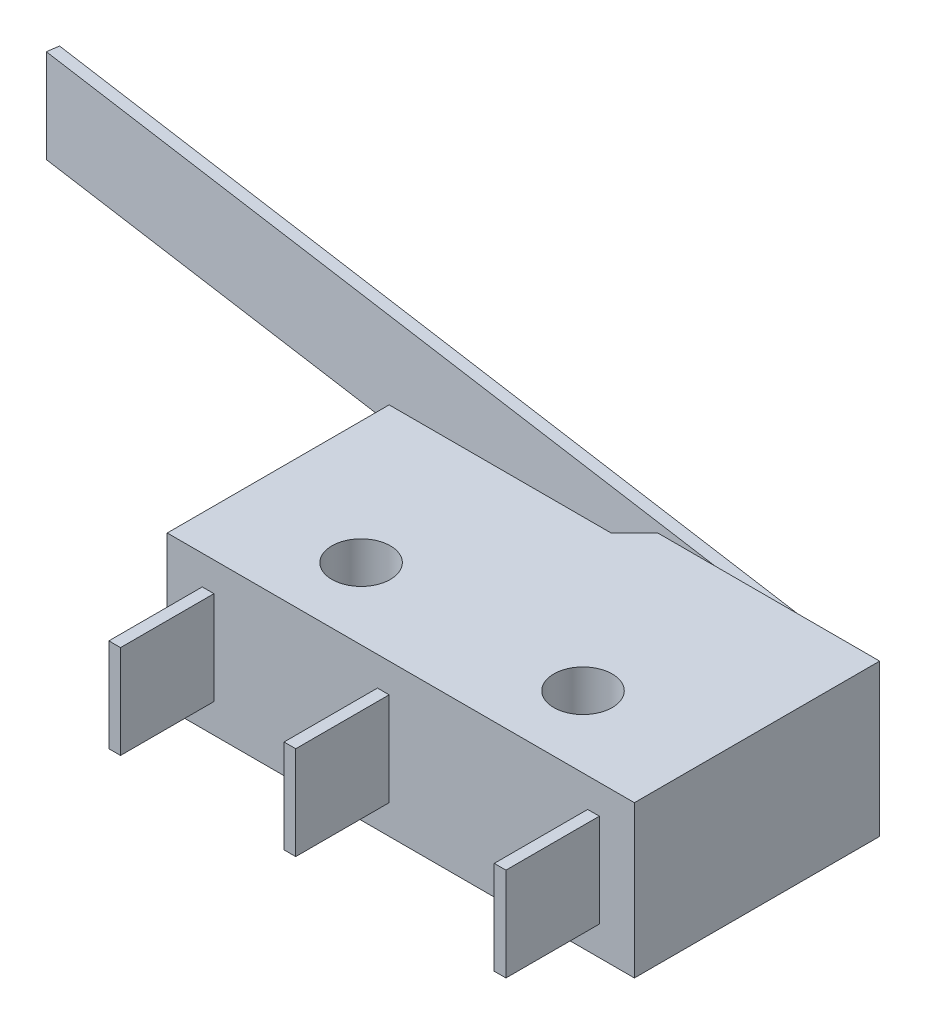
ISO-10303-21;
HEADER;
FILE_DESCRIPTION(('STEP AP214'),'2;1');
FILE_NAME('part.step','',(''),(''),'','','');
FILE_SCHEMA(('AUTOMOTIVE_DESIGN { 1 0 10303 214 1 1 1 1 }'));
ENDSEC;
DATA;
#1=APPLICATION_CONTEXT('core data for automotive mechanical design processes');
#2=APPLICATION_PROTOCOL_DEFINITION('international standard','automotive_design',2000,#1);
#3=PRODUCT_CONTEXT('',#1,'mechanical');
#4=PRODUCT('Part','Part','',(#3));
#5=PRODUCT_RELATED_PRODUCT_CATEGORY('part','',(#4));
#6=PRODUCT_DEFINITION_FORMATION('','',#4);
#7=PRODUCT_DEFINITION_CONTEXT('part definition',#1,'design');
#8=PRODUCT_DEFINITION('design','',#6,#7);
#9=PRODUCT_DEFINITION_SHAPE('','',#8);
#10=(LENGTH_UNIT() NAMED_UNIT(*) SI_UNIT(.MILLI.,.METRE.));
#11=(NAMED_UNIT(*) PLANE_ANGLE_UNIT() SI_UNIT($,.RADIAN.));
#12=(NAMED_UNIT(*) SI_UNIT($,.STERADIAN.) SOLID_ANGLE_UNIT());
#13=UNCERTAINTY_MEASURE_WITH_UNIT(LENGTH_MEASURE(1.E-05),#10,'distance_accuracy_value','');
#14=(GEOMETRIC_REPRESENTATION_CONTEXT(3) GLOBAL_UNCERTAINTY_ASSIGNED_CONTEXT((#13)) GLOBAL_UNIT_ASSIGNED_CONTEXT((#10,
#11,#12)) REPRESENTATION_CONTEXT('',''));
#15=CARTESIAN_POINT('',(0.,0.,0.));
#16=DIRECTION('',(0.,0.,1.));
#17=DIRECTION('',(1.,0.,0.));
#18=AXIS2_PLACEMENT_3D('',#15,#16,#17);
#19=CARTESIAN_POINT('',(0.,3.25,0.));
#20=DIRECTION('',(0.,0.,-1.));
#21=DIRECTION('',(-1.,0.,0.));
#22=AXIS2_PLACEMENT_3D('',#19,#20,#21);
#23=PLANE('',#22);
#24=DIRECTION('',(-1.,0.,0.));
#25=VECTOR('',#24,1.);
#26=CARTESIAN_POINT('',(9.5,2.,0.));
#27=LINE('',#26,#25);
#28=CARTESIAN_POINT('',(9.5,2.,0.));
#29=VERTEX_POINT('',#28);
#30=CARTESIAN_POINT('',(9.,2.,0.));
#31=VERTEX_POINT('',#30);
#32=EDGE_CURVE('E239',#29,#31,#27,.T.);
#33=ORIENTED_EDGE('',*,*,#32,.F.);
#34=DIRECTION('',(0.,-1.,0.));
#35=VECTOR('',#34,1.);
#36=CARTESIAN_POINT('',(9.5,2.,0.));
#37=LINE('',#36,#35);
#38=CARTESIAN_POINT('',(9.5,-2.,0.));
#39=VERTEX_POINT('',#38);
#40=EDGE_CURVE('E261',#29,#39,#37,.T.);
#41=ORIENTED_EDGE('',*,*,#40,.T.);
#42=DIRECTION('',(-1.,0.,0.));
#43=VECTOR('',#42,1.);
#44=CARTESIAN_POINT('',(9.5,-2.,0.));
#45=LINE('',#44,#43);
#46=CARTESIAN_POINT('',(9.,-2.,0.));
#47=VERTEX_POINT('',#46);
#48=EDGE_CURVE('E249',#39,#47,#45,.T.);
#49=ORIENTED_EDGE('',*,*,#48,.T.);
#50=DIRECTION('',(0.,-1.,0.));
#51=VECTOR('',#50,1.);
#52=CARTESIAN_POINT('',(9.,2.,0.));
#53=LINE('',#52,#51);
#54=EDGE_CURVE('E259',#31,#47,#53,.T.);
#55=ORIENTED_EDGE('',*,*,#54,.F.);
#56=EDGE_LOOP('',(#33,#41,#49,#55));
#57=FACE_BOUND('',#56,.T.);
#58=DIRECTION('',(1.,0.,0.));
#59=VECTOR('',#58,1.);
#60=CARTESIAN_POINT('',(0.,-3.25,0.));
#61=LINE('',#60,#59);
#62=CARTESIAN_POINT('',(0.,-3.25,0.));
#63=VERTEX_POINT('',#62);
#64=CARTESIAN_POINT('',(20.,-3.25,0.));
#65=VERTEX_POINT('',#64);
#66=EDGE_CURVE('E356',#63,#65,#61,.T.);
#67=ORIENTED_EDGE('',*,*,#66,.T.);
#68=DIRECTION('',(0.,-1.,0.));
#69=VECTOR('',#68,1.);
#70=CARTESIAN_POINT('',(20.,3.25,0.));
#71=LINE('',#70,#69);
#72=CARTESIAN_POINT('',(20.,3.25,0.));
#73=VERTEX_POINT('',#72);
#74=EDGE_CURVE('E41',#73,#65,#71,.T.);
#75=ORIENTED_EDGE('',*,*,#74,.F.);
#76=DIRECTION('',(1.,0.,0.));
#77=VECTOR('',#76,1.);
#78=CARTESIAN_POINT('',(0.,3.25,0.));
#79=LINE('',#78,#77);
#80=CARTESIAN_POINT('',(0.,3.25,0.));
#81=VERTEX_POINT('',#80);
#82=EDGE_CURVE('E342',#81,#73,#79,.T.);
#83=ORIENTED_EDGE('',*,*,#82,.F.);
#84=DIRECTION('',(0.,-1.,0.));
#85=VECTOR('',#84,1.);
#86=CARTESIAN_POINT('',(0.,3.25,0.));
#87=LINE('',#86,#85);
#88=EDGE_CURVE('E11',#81,#63,#87,.T.);
#89=ORIENTED_EDGE('',*,*,#88,.T.);
#90=EDGE_LOOP('',(#67,#75,#83,#89));
#91=FACE_BOUND('',#90,.T.);
#92=DIRECTION('',(-1.,0.,0.));
#93=VECTOR('',#92,1.);
#94=CARTESIAN_POINT('',(18.5,2.,0.));
#95=LINE('',#94,#93);
#96=CARTESIAN_POINT('',(18.5,2.,0.));
#97=VERTEX_POINT('',#96);
#98=CARTESIAN_POINT('',(18.,2.,0.));
#99=VERTEX_POINT('',#98);
#100=EDGE_CURVE('E267',#97,#99,#95,.T.);
#101=ORIENTED_EDGE('',*,*,#100,.F.);
#102=DIRECTION('',(0.,-1.,0.));
#103=VECTOR('',#102,1.);
#104=CARTESIAN_POINT('',(18.5,2.,0.));
#105=LINE('',#104,#103);
#106=CARTESIAN_POINT('',(18.5,-2.,0.));
#107=VERTEX_POINT('',#106);
#108=EDGE_CURVE('E291',#97,#107,#105,.T.);
#109=ORIENTED_EDGE('',*,*,#108,.T.);
#110=DIRECTION('',(-1.,0.,0.));
#111=VECTOR('',#110,1.);
#112=CARTESIAN_POINT('',(18.5,-2.,0.));
#113=LINE('',#112,#111);
#114=CARTESIAN_POINT('',(18.,-2.,0.));
#115=VERTEX_POINT('',#114);
#116=EDGE_CURVE('E277',#107,#115,#113,.T.);
#117=ORIENTED_EDGE('',*,*,#116,.T.);
#118=DIRECTION('',(0.,-1.,0.));
#119=VECTOR('',#118,1.);
#120=CARTESIAN_POINT('',(18.,2.,0.));
#121=LINE('',#120,#119);
#122=EDGE_CURVE('E288',#99,#115,#121,.T.);
#123=ORIENTED_EDGE('',*,*,#122,.F.);
#124=EDGE_LOOP('',(#101,#109,#117,#123));
#125=FACE_BOUND('',#124,.T.);
#126=DIRECTION('',(-1.,0.,0.));
#127=VECTOR('',#126,1.);
#128=CARTESIAN_POINT('',(2.,2.,0.));
#129=LINE('',#128,#127);
#130=CARTESIAN_POINT('',(2.,2.,0.));
#131=VERTEX_POINT('',#130);
#132=CARTESIAN_POINT('',(1.5,2.,0.));
#133=VERTEX_POINT('',#132);
#134=EDGE_CURVE('E198',#131,#133,#129,.T.);
#135=ORIENTED_EDGE('',*,*,#134,.F.);
#136=DIRECTION('',(0.,-1.,0.));
#137=VECTOR('',#136,1.);
#138=CARTESIAN_POINT('',(2.,2.,0.));
#139=LINE('',#138,#137);
#140=CARTESIAN_POINT('',(2.,-2.,0.));
#141=VERTEX_POINT('',#140);
#142=EDGE_CURVE('E209',#131,#141,#139,.T.);
#143=ORIENTED_EDGE('',*,*,#142,.T.);
#144=DIRECTION('',(-1.,0.,0.));
#145=VECTOR('',#144,1.);
#146=CARTESIAN_POINT('',(2.,-2.,0.));
#147=LINE('',#146,#145);
#148=CARTESIAN_POINT('',(1.5,-2.,0.));
#149=VERTEX_POINT('',#148);
#150=EDGE_CURVE('E227',#141,#149,#147,.T.);
#151=ORIENTED_EDGE('',*,*,#150,.T.);
#152=DIRECTION('',(0.,-1.,0.));
#153=VECTOR('',#152,1.);
#154=CARTESIAN_POINT('',(1.5,2.,0.));
#155=LINE('',#154,#153);
#156=EDGE_CURVE('E216',#133,#149,#155,.T.);
#157=ORIENTED_EDGE('',*,*,#156,.F.);
#158=EDGE_LOOP('',(#135,#143,#151,#157));
#159=FACE_BOUND('',#158,.T.);
#160=ADVANCED_FACE('F32',(#57,#91,#125,#159),#23,.F.);
#161=CARTESIAN_POINT('',(0.,3.25,0.));
#162=DIRECTION('',(1.,0.,0.));
#163=DIRECTION('',(0.,0.,-1.));
#164=AXIS2_PLACEMENT_3D('',#161,#162,#163);
#165=PLANE('',#164);
#166=DIRECTION('',(0.,0.,1.));
#167=VECTOR('',#166,1.);
#168=CARTESIAN_POINT('',(0.,-3.25,0.));
#169=LINE('',#168,#167);
#170=CARTESIAN_POINT('',(0.,-3.25,-9.5));
#171=VERTEX_POINT('',#170);
#172=EDGE_CURVE('E338',#171,#63,#169,.T.);
#173=ORIENTED_EDGE('',*,*,#172,.T.);
#174=ORIENTED_EDGE('',*,*,#88,.F.);
#175=DIRECTION('',(0.,0.,1.));
#176=VECTOR('',#175,1.);
#177=CARTESIAN_POINT('',(0.,3.25,0.));
#178=LINE('',#177,#176);
#179=CARTESIAN_POINT('',(0.,3.25,-9.5));
#180=VERTEX_POINT('',#179);
#181=EDGE_CURVE('E339',#180,#81,#178,.T.);
#182=ORIENTED_EDGE('',*,*,#181,.F.);
#183=DIRECTION('',(0.,-1.,0.));
#184=VECTOR('',#183,1.);
#185=CARTESIAN_POINT('',(0.,3.25,-9.5));
#186=LINE('',#185,#184);
#187=EDGE_CURVE('E353',#180,#171,#186,.T.);
#188=ORIENTED_EDGE('',*,*,#187,.T.);
#189=EDGE_LOOP('',(#173,#174,#182,#188));
#190=FACE_BOUND('',#189,.T.);
#191=ADVANCED_FACE('F34',(#190),#165,.F.);
#192=CARTESIAN_POINT('',(20.,3.25,0.));
#193=DIRECTION('',(-1.,0.,0.));
#194=DIRECTION('',(0.,0.,1.));
#195=AXIS2_PLACEMENT_3D('',#192,#193,#194);
#196=PLANE('',#195);
#197=DIRECTION('',(0.,0.,-1.));
#198=VECTOR('',#197,1.);
#199=CARTESIAN_POINT('',(20.,-3.25,0.));
#200=LINE('',#199,#198);
#201=CARTESIAN_POINT('',(20.,-3.25,-10.5));
#202=VERTEX_POINT('',#201);
#203=EDGE_CURVE('E358',#65,#202,#200,.T.);
#204=ORIENTED_EDGE('',*,*,#203,.T.);
#205=DIRECTION('',(0.,-1.,0.));
#206=VECTOR('',#205,1.);
#207=CARTESIAN_POINT('',(20.,3.25,-10.5));
#208=LINE('',#207,#206);
#209=CARTESIAN_POINT('',(20.,3.25,-10.5));
#210=VERTEX_POINT('',#209);
#211=EDGE_CURVE('E373',#210,#202,#208,.T.);
#212=ORIENTED_EDGE('',*,*,#211,.F.);
#213=DIRECTION('',(0.,0.,-1.));
#214=VECTOR('',#213,1.);
#215=CARTESIAN_POINT('',(20.,3.25,0.));
#216=LINE('',#215,#214);
#217=EDGE_CURVE('E345',#73,#210,#216,.T.);
#218=ORIENTED_EDGE('',*,*,#217,.F.);
#219=ORIENTED_EDGE('',*,*,#74,.T.);
#220=EDGE_LOOP('',(#204,#212,#218,#219));
#221=FACE_BOUND('',#220,.T.);
#222=ADVANCED_FACE('F412',(#221),#196,.F.);
#223=CARTESIAN_POINT('',(10.5,3.25,-10.5));
#224=DIRECTION('',(0.,0.,1.));
#225=DIRECTION('',(1.,0.,0.));
#226=AXIS2_PLACEMENT_3D('',#223,#224,#225);
#227=PLANE('',#226);
#228=DIRECTION('',(0.,-1.,0.));
#229=VECTOR('',#228,1.);
#230=CARTESIAN_POINT('',(17.,2.,-10.5));
#231=LINE('',#230,#229);
#232=CARTESIAN_POINT('',(17.,2.,-10.5));
#233=VERTEX_POINT('',#232);
#234=CARTESIAN_POINT('',(17.,-2.,-10.5));
#235=VERTEX_POINT('',#234);
#236=EDGE_CURVE('E335',#233,#235,#231,.T.);
#237=ORIENTED_EDGE('',*,*,#236,.F.);
#238=DIRECTION('',(1.,0.,0.));
#239=VECTOR('',#238,1.);
#240=CARTESIAN_POINT('',(16.5,2.,-10.5));
#241=LINE('',#240,#239);
#242=CARTESIAN_POINT('',(16.5,2.,-10.5));
#243=VERTEX_POINT('',#242);
#244=EDGE_CURVE('E295',#243,#233,#241,.T.);
#245=ORIENTED_EDGE('',*,*,#244,.F.);
#246=DIRECTION('',(0.,-1.,0.));
#247=VECTOR('',#246,1.);
#248=CARTESIAN_POINT('',(16.5,2.,-10.5));
#249=LINE('',#248,#247);
#250=CARTESIAN_POINT('',(16.5,-2.,-10.5));
#251=VERTEX_POINT('',#250);
#252=EDGE_CURVE('E310',#243,#251,#249,.T.);
#253=ORIENTED_EDGE('',*,*,#252,.T.);
#254=DIRECTION('',(1.,0.,0.));
#255=VECTOR('',#254,1.);
#256=CARTESIAN_POINT('',(16.5,-2.,-10.5));
#257=LINE('',#256,#255);
#258=EDGE_CURVE('E294',#251,#235,#257,.T.);
#259=ORIENTED_EDGE('',*,*,#258,.T.);
#260=EDGE_LOOP('',(#237,#245,#253,#259));
#261=FACE_BOUND('',#260,.T.);
#262=DIRECTION('',(-1.,0.,0.));
#263=VECTOR('',#262,1.);
#264=CARTESIAN_POINT('',(10.5,-3.25,-10.5));
#265=LINE('',#264,#263);
#266=CARTESIAN_POINT('',(10.5,-3.25,-10.5));
#267=VERTEX_POINT('',#266);
#268=EDGE_CURVE('E360',#202,#267,#265,.T.);
#269=ORIENTED_EDGE('',*,*,#268,.T.);
#270=DIRECTION('',(0.,-1.,0.));
#271=VECTOR('',#270,1.);
#272=CARTESIAN_POINT('',(10.5,3.25,-10.5));
#273=LINE('',#272,#271);
#274=CARTESIAN_POINT('',(10.5,3.25,-10.5));
#275=VERTEX_POINT('',#274);
#276=EDGE_CURVE('E370',#275,#267,#273,.T.);
#277=ORIENTED_EDGE('',*,*,#276,.F.);
#278=DIRECTION('',(-1.,0.,0.));
#279=VECTOR('',#278,1.);
#280=CARTESIAN_POINT('',(10.5,3.25,-10.5));
#281=LINE('',#280,#279);
#282=EDGE_CURVE('E347',#210,#275,#281,.T.);
#283=ORIENTED_EDGE('',*,*,#282,.F.);
#284=ORIENTED_EDGE('',*,*,#211,.T.);
#285=EDGE_LOOP('',(#269,#277,#283,#284));
#286=FACE_BOUND('',#285,.T.);
#287=ADVANCED_FACE('F418',(#261,#286),#227,.F.);
#288=CARTESIAN_POINT('',(9.5,3.25,-9.5));
#289=DIRECTION('',(0.707106781186547,0.,0.707106781186548));
#290=DIRECTION('',(0.707106781186548,0.,-0.707106781186547));
#291=AXIS2_PLACEMENT_3D('',#288,#289,#290);
#292=PLANE('',#291);
#293=DIRECTION('',(-0.707106781186548,0.,0.707106781186547));
#294=VECTOR('',#293,1.);
#295=CARTESIAN_POINT('',(9.5,-3.25,-9.5));
#296=LINE('',#295,#294);
#297=CARTESIAN_POINT('',(9.5,-3.25,-9.5));
#298=VERTEX_POINT('',#297);
#299=EDGE_CURVE('E362',#267,#298,#296,.T.);
#300=ORIENTED_EDGE('',*,*,#299,.T.);
#301=DIRECTION('',(0.,-1.,0.));
#302=VECTOR('',#301,1.);
#303=CARTESIAN_POINT('',(9.5,3.25,-9.5));
#304=LINE('',#303,#302);
#305=CARTESIAN_POINT('',(9.5,3.25,-9.5));
#306=VERTEX_POINT('',#305);
#307=EDGE_CURVE('E367',#306,#298,#304,.T.);
#308=ORIENTED_EDGE('',*,*,#307,.F.);
#309=DIRECTION('',(-0.707106781186548,0.,0.707106781186547));
#310=VECTOR('',#309,1.);
#311=CARTESIAN_POINT('',(9.5,3.25,-9.5));
#312=LINE('',#311,#310);
#313=EDGE_CURVE('E349',#275,#306,#312,.T.);
#314=ORIENTED_EDGE('',*,*,#313,.F.);
#315=ORIENTED_EDGE('',*,*,#276,.T.);
#316=EDGE_LOOP('',(#300,#308,#314,#315));
#317=FACE_BOUND('',#316,.T.);
#318=ADVANCED_FACE('F422',(#317),#292,.F.);
#319=CARTESIAN_POINT('',(0.,3.25,-9.5));
#320=DIRECTION('',(0.,0.,1.));
#321=DIRECTION('',(1.,0.,0.));
#322=AXIS2_PLACEMENT_3D('',#319,#320,#321);
#323=PLANE('',#322);
#324=DIRECTION('',(-1.,0.,0.));
#325=VECTOR('',#324,1.);
#326=CARTESIAN_POINT('',(0.,-3.25,-9.5));
#327=LINE('',#326,#325);
#328=EDGE_CURVE('E343',#298,#171,#327,.T.);
#329=ORIENTED_EDGE('',*,*,#328,.T.);
#330=ORIENTED_EDGE('',*,*,#187,.F.);
#331=DIRECTION('',(-1.,0.,0.));
#332=VECTOR('',#331,1.);
#333=CARTESIAN_POINT('',(0.,3.25,-9.5));
#334=LINE('',#333,#332);
#335=EDGE_CURVE('E351',#306,#180,#334,.T.);
#336=ORIENTED_EDGE('',*,*,#335,.F.);
#337=ORIENTED_EDGE('',*,*,#307,.T.);
#338=EDGE_LOOP('',(#329,#330,#336,#337));
#339=FACE_BOUND('',#338,.T.);
#340=ADVANCED_FACE('F396',(#339),#323,.F.);
#341=CARTESIAN_POINT('',(0.,3.25,0.));
#342=DIRECTION('',(0.,-1.,0.));
#343=DIRECTION('',(0.,0.,-1.));
#344=AXIS2_PLACEMENT_3D('',#341,#342,#343);
#345=PLANE('',#344);
#346=CARTESIAN_POINT('',(14.75,3.25,-3.05));
#347=DIRECTION('',(0.,1.,0.));
#348=DIRECTION('',(0.,0.,1.));
#349=AXIS2_PLACEMENT_3D('',#346,#347,#348);
#350=CIRCLE('',#349,1.25);
#351=CARTESIAN_POINT('',(14.75,3.25,-1.8));
#352=VERTEX_POINT('',#351);
#353=EDGE_CURVE('E385',#352,#352,#350,.T.);
#354=ORIENTED_EDGE('',*,*,#353,.F.);
#355=EDGE_LOOP('',(#354));
#356=FACE_BOUND('',#355,.T.);
#357=CARTESIAN_POINT('',(5.25,3.25,-3.05));
#358=DIRECTION('',(0.,1.,0.));
#359=DIRECTION('',(0.,0.,1.));
#360=AXIS2_PLACEMENT_3D('',#357,#358,#359);
#361=CIRCLE('',#360,1.25);
#362=CARTESIAN_POINT('',(5.25,3.25,-1.8));
#363=VERTEX_POINT('',#362);
#364=EDGE_CURVE('E378',#363,#363,#361,.T.);
#365=ORIENTED_EDGE('',*,*,#364,.F.);
#366=EDGE_LOOP('',(#365));
#367=FACE_BOUND('',#366,.T.);
#368=ORIENTED_EDGE('',*,*,#181,.T.);
#369=ORIENTED_EDGE('',*,*,#82,.T.);
#370=ORIENTED_EDGE('',*,*,#217,.T.);
#371=ORIENTED_EDGE('',*,*,#282,.T.);
#372=ORIENTED_EDGE('',*,*,#313,.T.);
#373=ORIENTED_EDGE('',*,*,#335,.T.);
#374=EDGE_LOOP('',(#368,#369,#370,#371,#372,#373));
#375=FACE_BOUND('',#374,.T.);
#376=ADVANCED_FACE('F392',(#356,#367,#375),#345,.F.);
#377=CARTESIAN_POINT('',(0.,-3.25,0.));
#378=DIRECTION('',(0.,-1.,0.));
#379=DIRECTION('',(0.,0.,-1.));
#380=AXIS2_PLACEMENT_3D('',#377,#378,#379);
#381=PLANE('',#380);
#382=CARTESIAN_POINT('',(14.75,-3.25,-3.05));
#383=DIRECTION('',(0.,-1.,0.));
#384=DIRECTION('',(0.,0.,-1.));
#385=AXIS2_PLACEMENT_3D('',#382,#383,#384);
#386=CIRCLE('',#385,1.25);
#387=CARTESIAN_POINT('',(14.75,-3.25,-4.3));
#388=VERTEX_POINT('',#387);
#389=EDGE_CURVE('E36',#388,#388,#386,.T.);
#390=ORIENTED_EDGE('',*,*,#389,.F.);
#391=EDGE_LOOP('',(#390));
#392=FACE_BOUND('',#391,.T.);
#393=CARTESIAN_POINT('',(5.25,-3.25,-3.05));
#394=DIRECTION('',(0.,-1.,0.));
#395=DIRECTION('',(0.,0.,-1.));
#396=AXIS2_PLACEMENT_3D('',#393,#394,#395);
#397=CIRCLE('',#396,1.25);
#398=CARTESIAN_POINT('',(5.25,-3.25,-4.3));
#399=VERTEX_POINT('',#398);
#400=EDGE_CURVE('E228',#399,#399,#397,.T.);
#401=ORIENTED_EDGE('',*,*,#400,.F.);
#402=EDGE_LOOP('',(#401));
#403=FACE_BOUND('',#402,.T.);
#404=ORIENTED_EDGE('',*,*,#172,.F.);
#405=ORIENTED_EDGE('',*,*,#328,.F.);
#406=ORIENTED_EDGE('',*,*,#299,.F.);
#407=ORIENTED_EDGE('',*,*,#268,.F.);
#408=ORIENTED_EDGE('',*,*,#203,.F.);
#409=ORIENTED_EDGE('',*,*,#66,.F.);
#410=EDGE_LOOP('',(#404,#405,#406,#407,#408,#409));
#411=FACE_BOUND('',#410,.T.);
#412=ADVANCED_FACE('F395',(#392,#403,#411),#381,.T.);
#413=CARTESIAN_POINT('',(17.,2.,-10.5));
#414=DIRECTION('',(-1.,0.,0.));
#415=DIRECTION('',(0.,0.,1.));
#416=AXIS2_PLACEMENT_3D('',#413,#414,#415);
#417=PLANE('',#416);
#418=DIRECTION('',(0.,0.,-1.));
#419=VECTOR('',#418,1.);
#420=CARTESIAN_POINT('',(17.,-2.,-10.5));
#421=LINE('',#420,#419);
#422=CARTESIAN_POINT('',(17.,-2.,-11.5));
#423=VERTEX_POINT('',#422);
#424=EDGE_CURVE('E312',#235,#423,#421,.T.);
#425=ORIENTED_EDGE('',*,*,#424,.T.);
#426=DIRECTION('',(0.,-1.,0.));
#427=VECTOR('',#426,1.);
#428=CARTESIAN_POINT('',(17.,2.,-11.5));
#429=LINE('',#428,#427);
#430=CARTESIAN_POINT('',(17.,2.,-11.5));
#431=VERTEX_POINT('',#430);
#432=EDGE_CURVE('E332',#431,#423,#429,.T.);
#433=ORIENTED_EDGE('',*,*,#432,.F.);
#434=DIRECTION('',(0.,0.,-1.));
#435=VECTOR('',#434,1.);
#436=CARTESIAN_POINT('',(17.,2.,-10.5));
#437=LINE('',#436,#435);
#438=EDGE_CURVE('E298',#233,#431,#437,.T.);
#439=ORIENTED_EDGE('',*,*,#438,.F.);
#440=ORIENTED_EDGE('',*,*,#236,.T.);
#441=EDGE_LOOP('',(#425,#433,#439,#440));
#442=FACE_BOUND('',#441,.T.);
#443=ADVANCED_FACE('F427',(#442),#417,.F.);
#444=CARTESIAN_POINT('',(17.,2.,-11.5));
#445=DIRECTION('',(-0.141025641025641,0.,0.99000594370605));
#446=DIRECTION('',(0.99000594370605,0.,0.141025641025641));
#447=AXIS2_PLACEMENT_3D('',#444,#445,#446);
#448=PLANE('',#447);
#449=DIRECTION('',(-0.99000594370605,0.,-0.141025641025641));
#450=VECTOR('',#449,1.);
#451=CARTESIAN_POINT('',(17.,-2.,-11.5));
#452=LINE('',#451,#450);
#453=CARTESIAN_POINT('',(-21.610231804536,-2.,-17.));
#454=VERTEX_POINT('',#453);
#455=EDGE_CURVE('E314',#423,#454,#452,.T.);
#456=ORIENTED_EDGE('',*,*,#455,.T.);
#457=DIRECTION('',(0.,-1.,0.));
#458=VECTOR('',#457,1.);
#459=CARTESIAN_POINT('',(-21.610231804536,2.,-17.));
#460=LINE('',#459,#458);
#461=CARTESIAN_POINT('',(-21.610231804536,2.,-17.));
#462=VERTEX_POINT('',#461);
#463=EDGE_CURVE('E329',#462,#454,#460,.T.);
#464=ORIENTED_EDGE('',*,*,#463,.F.);
#465=DIRECTION('',(-0.99000594370605,0.,-0.141025641025641));
#466=VECTOR('',#465,1.);
#467=CARTESIAN_POINT('',(17.,2.,-11.5));
#468=LINE('',#467,#466);
#469=EDGE_CURVE('E301',#431,#462,#468,.T.);
#470=ORIENTED_EDGE('',*,*,#469,.F.);
#471=ORIENTED_EDGE('',*,*,#432,.T.);
#472=EDGE_LOOP('',(#456,#464,#470,#471));
#473=FACE_BOUND('',#472,.T.);
#474=ADVANCED_FACE('F433',(#473),#448,.F.);
#475=CARTESIAN_POINT('',(-21.610231804536,2.,-17.));
#476=DIRECTION('',(0.990005943706051,0.,0.141025641025639));
#477=DIRECTION('',(0.141025641025639,0.,-0.990005943706051));
#478=AXIS2_PLACEMENT_3D('',#475,#476,#477);
#479=PLANE('',#478);
#480=DIRECTION('',(-0.141025641025639,0.,0.990005943706051));
#481=VECTOR('',#480,1.);
#482=CARTESIAN_POINT('',(-21.610231804536,-2.,-17.));
#483=LINE('',#482,#481);
#484=CARTESIAN_POINT('',(-21.6807446250488,-2.,-16.504997028147));
#485=VERTEX_POINT('',#484);
#486=EDGE_CURVE('E316',#454,#485,#483,.T.);
#487=ORIENTED_EDGE('',*,*,#486,.T.);
#488=DIRECTION('',(0.,-1.,0.));
#489=VECTOR('',#488,1.);
#490=CARTESIAN_POINT('',(-21.6807446250488,2.,-16.504997028147));
#491=LINE('',#490,#489);
#492=CARTESIAN_POINT('',(-21.6807446250488,2.,-16.504997028147));
#493=VERTEX_POINT('',#492);
#494=EDGE_CURVE('E326',#493,#485,#491,.T.);
#495=ORIENTED_EDGE('',*,*,#494,.F.);
#496=DIRECTION('',(-0.141025641025639,0.,0.990005943706051));
#497=VECTOR('',#496,1.);
#498=CARTESIAN_POINT('',(-21.610231804536,2.,-17.));
#499=LINE('',#498,#497);
#500=EDGE_CURVE('E303',#462,#493,#499,.T.);
#501=ORIENTED_EDGE('',*,*,#500,.F.);
#502=ORIENTED_EDGE('',*,*,#463,.T.);
#503=EDGE_LOOP('',(#487,#495,#501,#502));
#504=FACE_BOUND('',#503,.T.);
#505=ADVANCED_FACE('F562',(#504),#479,.F.);
#506=CARTESIAN_POINT('',(-21.6807446250488,2.,-16.504997028147));
#507=DIRECTION('',(0.141025641025641,0.,-0.99000594370605));
#508=DIRECTION('',(-0.99000594370605,0.,-0.141025641025641));
#509=AXIS2_PLACEMENT_3D('',#506,#507,#508);
#510=PLANE('',#509);
#511=DIRECTION('',(0.99000594370605,0.,0.141025641025641));
#512=VECTOR('',#511,1.);
#513=CARTESIAN_POINT('',(-21.6807446250488,-2.,-16.504997028147));
#514=LINE('',#513,#512);
#515=CARTESIAN_POINT('',(16.5,-2.,-11.0661771707356));
#516=VERTEX_POINT('',#515);
#517=EDGE_CURVE('E318',#485,#516,#514,.T.);
#518=ORIENTED_EDGE('',*,*,#517,.T.);
#519=DIRECTION('',(0.,-1.,0.));
#520=VECTOR('',#519,1.);
#521=CARTESIAN_POINT('',(16.5,2.,-11.0661771707356));
#522=LINE('',#521,#520);
#523=CARTESIAN_POINT('',(16.5,2.,-11.0661771707356));
#524=VERTEX_POINT('',#523);
#525=EDGE_CURVE('E323',#524,#516,#522,.T.);
#526=ORIENTED_EDGE('',*,*,#525,.F.);
#527=DIRECTION('',(0.99000594370605,0.,0.141025641025641));
#528=VECTOR('',#527,1.);
#529=CARTESIAN_POINT('',(-21.6807446250488,2.,-16.504997028147));
#530=LINE('',#529,#528);
#531=EDGE_CURVE('E305',#493,#524,#530,.T.);
#532=ORIENTED_EDGE('',*,*,#531,.F.);
#533=ORIENTED_EDGE('',*,*,#494,.T.);
#534=EDGE_LOOP('',(#518,#526,#532,#533));
#535=FACE_BOUND('',#534,.T.);
#536=ADVANCED_FACE('F558',(#535),#510,.F.);
#537=CARTESIAN_POINT('',(16.5,2.,-11.0661771707356));
#538=DIRECTION('',(1.,0.,0.));
#539=DIRECTION('',(0.,0.,-1.));
#540=AXIS2_PLACEMENT_3D('',#537,#538,#539);
#541=PLANE('',#540);
#542=DIRECTION('',(0.,0.,1.));
#543=VECTOR('',#542,1.);
#544=CARTESIAN_POINT('',(16.5,-2.,-11.0661771707356));
#545=LINE('',#544,#543);
#546=EDGE_CURVE('E299',#516,#251,#545,.T.);
#547=ORIENTED_EDGE('',*,*,#546,.T.);
#548=ORIENTED_EDGE('',*,*,#252,.F.);
#549=DIRECTION('',(0.,0.,1.));
#550=VECTOR('',#549,1.);
#551=CARTESIAN_POINT('',(16.5,2.,-11.0661771707356));
#552=LINE('',#551,#550);
#553=EDGE_CURVE('E307',#524,#243,#552,.T.);
#554=ORIENTED_EDGE('',*,*,#553,.F.);
#555=ORIENTED_EDGE('',*,*,#525,.T.);
#556=EDGE_LOOP('',(#547,#548,#554,#555));
#557=FACE_BOUND('',#556,.T.);
#558=ADVANCED_FACE('F551',(#557),#541,.F.);
#559=CARTESIAN_POINT('',(0.,2.,0.));
#560=DIRECTION('',(0.,1.,0.));
#561=DIRECTION('',(0.,0.,1.));
#562=AXIS2_PLACEMENT_3D('',#559,#560,#561);
#563=PLANE('',#562);
#564=ORIENTED_EDGE('',*,*,#244,.T.);
#565=ORIENTED_EDGE('',*,*,#438,.T.);
#566=ORIENTED_EDGE('',*,*,#469,.T.);
#567=ORIENTED_EDGE('',*,*,#500,.T.);
#568=ORIENTED_EDGE('',*,*,#531,.T.);
#569=ORIENTED_EDGE('',*,*,#553,.T.);
#570=EDGE_LOOP('',(#564,#565,#566,#567,#568,#569));
#571=FACE_BOUND('',#570,.T.);
#572=ADVANCED_FACE('F548',(#571),#563,.T.);
#573=CARTESIAN_POINT('',(0.,-2.,0.));
#574=DIRECTION('',(0.,1.,0.));
#575=DIRECTION('',(0.,0.,1.));
#576=AXIS2_PLACEMENT_3D('',#573,#574,#575);
#577=PLANE('',#576);
#578=ORIENTED_EDGE('',*,*,#258,.F.);
#579=ORIENTED_EDGE('',*,*,#546,.F.);
#580=ORIENTED_EDGE('',*,*,#517,.F.);
#581=ORIENTED_EDGE('',*,*,#486,.F.);
#582=ORIENTED_EDGE('',*,*,#455,.F.);
#583=ORIENTED_EDGE('',*,*,#424,.F.);
#584=EDGE_LOOP('',(#578,#579,#580,#581,#582,#583));
#585=FACE_BOUND('',#584,.T.);
#586=ADVANCED_FACE('F546',(#585),#577,.F.);
#587=CARTESIAN_POINT('',(18.5,2.,0.));
#588=DIRECTION('',(-1.,0.,0.));
#589=DIRECTION('',(0.,0.,1.));
#590=AXIS2_PLACEMENT_3D('',#587,#588,#589);
#591=PLANE('',#590);
#592=DIRECTION('',(0.,0.,-1.));
#593=VECTOR('',#592,1.);
#594=CARTESIAN_POINT('',(18.5,-2.,0.));
#595=LINE('',#594,#593);
#596=CARTESIAN_POINT('',(18.5,-2.,3.99999999999999));
#597=VERTEX_POINT('',#596);
#598=EDGE_CURVE('E264',#597,#107,#595,.T.);
#599=ORIENTED_EDGE('',*,*,#598,.T.);
#600=ORIENTED_EDGE('',*,*,#108,.F.);
#601=DIRECTION('',(0.,0.,-1.));
#602=VECTOR('',#601,1.);
#603=CARTESIAN_POINT('',(18.5,2.,0.));
#604=LINE('',#603,#602);
#605=CARTESIAN_POINT('',(18.5,2.,3.99999999999999));
#606=VERTEX_POINT('',#605);
#607=EDGE_CURVE('E265',#606,#97,#604,.T.);
#608=ORIENTED_EDGE('',*,*,#607,.F.);
#609=DIRECTION('',(0.,-1.,0.));
#610=VECTOR('',#609,1.);
#611=CARTESIAN_POINT('',(18.5,2.,3.99999999999999));
#612=LINE('',#611,#610);
#613=EDGE_CURVE('E274',#606,#597,#612,.T.);
#614=ORIENTED_EDGE('',*,*,#613,.T.);
#615=EDGE_LOOP('',(#599,#600,#608,#614));
#616=FACE_BOUND('',#615,.T.);
#617=ADVANCED_FACE('F542',(#616),#591,.F.);
#618=CARTESIAN_POINT('',(18.,2.,0.));
#619=DIRECTION('',(1.,0.,0.));
#620=DIRECTION('',(0.,0.,-1.));
#621=AXIS2_PLACEMENT_3D('',#618,#619,#620);
#622=PLANE('',#621);
#623=DIRECTION('',(0.,0.,1.));
#624=VECTOR('',#623,1.);
#625=CARTESIAN_POINT('',(18.,-2.,0.));
#626=LINE('',#625,#624);
#627=CARTESIAN_POINT('',(18.,-2.,3.99999999999999));
#628=VERTEX_POINT('',#627);
#629=EDGE_CURVE('E280',#115,#628,#626,.T.);
#630=ORIENTED_EDGE('',*,*,#629,.T.);
#631=DIRECTION('',(0.,-1.,0.));
#632=VECTOR('',#631,1.);
#633=CARTESIAN_POINT('',(18.,2.,3.99999999999999));
#634=LINE('',#633,#632);
#635=CARTESIAN_POINT('',(18.,2.,3.99999999999999));
#636=VERTEX_POINT('',#635);
#637=EDGE_CURVE('E285',#636,#628,#634,.T.);
#638=ORIENTED_EDGE('',*,*,#637,.F.);
#639=DIRECTION('',(0.,0.,1.));
#640=VECTOR('',#639,1.);
#641=CARTESIAN_POINT('',(18.,2.,0.));
#642=LINE('',#641,#640);
#643=EDGE_CURVE('E270',#99,#636,#642,.T.);
#644=ORIENTED_EDGE('',*,*,#643,.F.);
#645=ORIENTED_EDGE('',*,*,#122,.T.);
#646=EDGE_LOOP('',(#630,#638,#644,#645));
#647=FACE_BOUND('',#646,.T.);
#648=ADVANCED_FACE('F538',(#647),#622,.F.);
#649=CARTESIAN_POINT('',(18.5,2.,3.99999999999999));
#650=DIRECTION('',(0.,0.,-1.));
#651=DIRECTION('',(-1.,0.,0.));
#652=AXIS2_PLACEMENT_3D('',#649,#650,#651);
#653=PLANE('',#652);
#654=DIRECTION('',(1.,0.,0.));
#655=VECTOR('',#654,1.);
#656=CARTESIAN_POINT('',(18.5,-2.,3.99999999999999));
#657=LINE('',#656,#655);
#658=EDGE_CURVE('E268',#628,#597,#657,.T.);
#659=ORIENTED_EDGE('',*,*,#658,.T.);
#660=ORIENTED_EDGE('',*,*,#613,.F.);
#661=DIRECTION('',(1.,0.,0.));
#662=VECTOR('',#661,1.);
#663=CARTESIAN_POINT('',(18.5,2.,3.99999999999999));
#664=LINE('',#663,#662);
#665=EDGE_CURVE('E272',#636,#606,#664,.T.);
#666=ORIENTED_EDGE('',*,*,#665,.F.);
#667=ORIENTED_EDGE('',*,*,#637,.T.);
#668=EDGE_LOOP('',(#659,#660,#666,#667));
#669=FACE_BOUND('',#668,.T.);
#670=ADVANCED_FACE('F531',(#669),#653,.F.);
#671=CARTESIAN_POINT('',(0.,2.,0.));
#672=DIRECTION('',(0.,-1.,0.));
#673=DIRECTION('',(0.,0.,-1.));
#674=AXIS2_PLACEMENT_3D('',#671,#672,#673);
#675=PLANE('',#674);
#676=ORIENTED_EDGE('',*,*,#607,.T.);
#677=ORIENTED_EDGE('',*,*,#100,.T.);
#678=ORIENTED_EDGE('',*,*,#643,.T.);
#679=ORIENTED_EDGE('',*,*,#665,.T.);
#680=EDGE_LOOP('',(#676,#677,#678,#679));
#681=FACE_BOUND('',#680,.T.);
#682=ADVANCED_FACE('F528',(#681),#675,.F.);
#683=CARTESIAN_POINT('',(0.,-2.,0.));
#684=DIRECTION('',(0.,-1.,0.));
#685=DIRECTION('',(0.,0.,-1.));
#686=AXIS2_PLACEMENT_3D('',#683,#684,#685);
#687=PLANE('',#686);
#688=ORIENTED_EDGE('',*,*,#598,.F.);
#689=ORIENTED_EDGE('',*,*,#658,.F.);
#690=ORIENTED_EDGE('',*,*,#629,.F.);
#691=ORIENTED_EDGE('',*,*,#116,.F.);
#692=EDGE_LOOP('',(#688,#689,#690,#691));
#693=FACE_BOUND('',#692,.T.);
#694=ADVANCED_FACE('F526',(#693),#687,.T.);
#695=CARTESIAN_POINT('',(9.5,2.,0.));
#696=DIRECTION('',(-1.,0.,0.));
#697=DIRECTION('',(0.,0.,1.));
#698=AXIS2_PLACEMENT_3D('',#695,#696,#697);
#699=PLANE('',#698);
#700=DIRECTION('',(0.,0.,-1.));
#701=VECTOR('',#700,1.);
#702=CARTESIAN_POINT('',(9.5,-2.,0.));
#703=LINE('',#702,#701);
#704=CARTESIAN_POINT('',(9.5,-2.,3.99999999999999));
#705=VERTEX_POINT('',#704);
#706=EDGE_CURVE('E215',#705,#39,#703,.T.);
#707=ORIENTED_EDGE('',*,*,#706,.T.);
#708=ORIENTED_EDGE('',*,*,#40,.F.);
#709=DIRECTION('',(0.,0.,-1.));
#710=VECTOR('',#709,1.);
#711=CARTESIAN_POINT('',(9.5,2.,0.));
#712=LINE('',#711,#710);
#713=CARTESIAN_POINT('',(9.5,2.,3.99999999999999));
#714=VERTEX_POINT('',#713);
#715=EDGE_CURVE('E237',#714,#29,#712,.T.);
#716=ORIENTED_EDGE('',*,*,#715,.F.);
#717=DIRECTION('',(0.,-1.,0.));
#718=VECTOR('',#717,1.);
#719=CARTESIAN_POINT('',(9.5,2.,3.99999999999999));
#720=LINE('',#719,#718);
#721=EDGE_CURVE('E246',#714,#705,#720,.T.);
#722=ORIENTED_EDGE('',*,*,#721,.T.);
#723=EDGE_LOOP('',(#707,#708,#716,#722));
#724=FACE_BOUND('',#723,.T.);
#725=ADVANCED_FACE('F522',(#724),#699,.F.);
#726=CARTESIAN_POINT('',(9.,2.,0.));
#727=DIRECTION('',(1.,0.,0.));
#728=DIRECTION('',(0.,0.,-1.));
#729=AXIS2_PLACEMENT_3D('',#726,#727,#728);
#730=PLANE('',#729);
#731=DIRECTION('',(0.,0.,1.));
#732=VECTOR('',#731,1.);
#733=CARTESIAN_POINT('',(9.,-2.,0.));
#734=LINE('',#733,#732);
#735=CARTESIAN_POINT('',(9.,-2.,3.99999999999999));
#736=VERTEX_POINT('',#735);
#737=EDGE_CURVE('E57',#47,#736,#734,.T.);
#738=ORIENTED_EDGE('',*,*,#737,.T.);
#739=DIRECTION('',(0.,-1.,0.));
#740=VECTOR('',#739,1.);
#741=CARTESIAN_POINT('',(9.,2.,3.99999999999999));
#742=LINE('',#741,#740);
#743=CARTESIAN_POINT('',(9.,2.,3.99999999999999));
#744=VERTEX_POINT('',#743);
#745=EDGE_CURVE('E256',#744,#736,#742,.T.);
#746=ORIENTED_EDGE('',*,*,#745,.F.);
#747=DIRECTION('',(0.,0.,1.));
#748=VECTOR('',#747,1.);
#749=CARTESIAN_POINT('',(9.,2.,0.));
#750=LINE('',#749,#748);
#751=EDGE_CURVE('E242',#31,#744,#750,.T.);
#752=ORIENTED_EDGE('',*,*,#751,.F.);
#753=ORIENTED_EDGE('',*,*,#54,.T.);
#754=EDGE_LOOP('',(#738,#746,#752,#753));
#755=FACE_BOUND('',#754,.T.);
#756=ADVANCED_FACE('F518',(#755),#730,.F.);
#757=CARTESIAN_POINT('',(9.5,2.,3.99999999999999));
#758=DIRECTION('',(0.,0.,-1.));
#759=DIRECTION('',(-1.,0.,0.));
#760=AXIS2_PLACEMENT_3D('',#757,#758,#759);
#761=PLANE('',#760);
#762=DIRECTION('',(1.,0.,0.));
#763=VECTOR('',#762,1.);
#764=CARTESIAN_POINT('',(9.5,-2.,3.99999999999999));
#765=LINE('',#764,#763);
#766=EDGE_CURVE('E240',#736,#705,#765,.T.);
#767=ORIENTED_EDGE('',*,*,#766,.T.);
#768=ORIENTED_EDGE('',*,*,#721,.F.);
#769=DIRECTION('',(1.,0.,0.));
#770=VECTOR('',#769,1.);
#771=CARTESIAN_POINT('',(9.5,2.,3.99999999999999));
#772=LINE('',#771,#770);
#773=EDGE_CURVE('E244',#744,#714,#772,.T.);
#774=ORIENTED_EDGE('',*,*,#773,.F.);
#775=ORIENTED_EDGE('',*,*,#745,.T.);
#776=EDGE_LOOP('',(#767,#768,#774,#775));
#777=FACE_BOUND('',#776,.T.);
#778=ADVANCED_FACE('F512',(#777),#761,.F.);
#779=CARTESIAN_POINT('',(0.,2.,0.));
#780=DIRECTION('',(0.,-1.,0.));
#781=DIRECTION('',(0.,0.,-1.));
#782=AXIS2_PLACEMENT_3D('',#779,#780,#781);
#783=PLANE('',#782);
#784=ORIENTED_EDGE('',*,*,#715,.T.);
#785=ORIENTED_EDGE('',*,*,#32,.T.);
#786=ORIENTED_EDGE('',*,*,#751,.T.);
#787=ORIENTED_EDGE('',*,*,#773,.T.);
#788=EDGE_LOOP('',(#784,#785,#786,#787));
#789=FACE_BOUND('',#788,.T.);
#790=ADVANCED_FACE('F509',(#789),#783,.F.);
#791=CARTESIAN_POINT('',(0.,-2.,0.));
#792=DIRECTION('',(0.,-1.,0.));
#793=DIRECTION('',(0.,0.,-1.));
#794=AXIS2_PLACEMENT_3D('',#791,#792,#793);
#795=PLANE('',#794);
#796=ORIENTED_EDGE('',*,*,#706,.F.);
#797=ORIENTED_EDGE('',*,*,#766,.F.);
#798=ORIENTED_EDGE('',*,*,#737,.F.);
#799=ORIENTED_EDGE('',*,*,#48,.F.);
#800=EDGE_LOOP('',(#796,#797,#798,#799));
#801=FACE_BOUND('',#800,.T.);
#802=ADVANCED_FACE('F508',(#801),#795,.T.);
#803=CARTESIAN_POINT('',(2.,2.,0.));
#804=DIRECTION('',(-1.,0.,0.));
#805=DIRECTION('',(0.,0.,1.));
#806=AXIS2_PLACEMENT_3D('',#803,#804,#805);
#807=PLANE('',#806);
#808=DIRECTION('',(0.,0.,-1.));
#809=VECTOR('',#808,1.);
#810=CARTESIAN_POINT('',(2.,-2.,0.));
#811=LINE('',#810,#809);
#812=CARTESIAN_POINT('',(2.,-2.,4.));
#813=VERTEX_POINT('',#812);
#814=EDGE_CURVE('E212',#813,#141,#811,.T.);
#815=ORIENTED_EDGE('',*,*,#814,.T.);
#816=ORIENTED_EDGE('',*,*,#142,.F.);
#817=DIRECTION('',(0.,0.,-1.));
#818=VECTOR('',#817,1.);
#819=CARTESIAN_POINT('',(2.,2.,0.));
#820=LINE('',#819,#818);
#821=CARTESIAN_POINT('',(2.,2.,4.));
#822=VERTEX_POINT('',#821);
#823=EDGE_CURVE('E194',#822,#131,#820,.T.);
#824=ORIENTED_EDGE('',*,*,#823,.F.);
#825=DIRECTION('',(0.,-1.,0.));
#826=VECTOR('',#825,1.);
#827=CARTESIAN_POINT('',(2.,2.,4.));
#828=LINE('',#827,#826);
#829=EDGE_CURVE('E225',#822,#813,#828,.T.);
#830=ORIENTED_EDGE('',*,*,#829,.T.);
#831=EDGE_LOOP('',(#815,#816,#824,#830));
#832=FACE_BOUND('',#831,.T.);
#833=ADVANCED_FACE('F210',(#832),#807,.F.);
#834=CARTESIAN_POINT('',(1.5,2.,0.));
#835=DIRECTION('',(1.,0.,0.));
#836=DIRECTION('',(0.,0.,-1.));
#837=AXIS2_PLACEMENT_3D('',#834,#835,#836);
#838=PLANE('',#837);
#839=DIRECTION('',(0.,0.,1.));
#840=VECTOR('',#839,1.);
#841=CARTESIAN_POINT('',(1.5,-2.,0.));
#842=LINE('',#841,#840);
#843=CARTESIAN_POINT('',(1.5,-2.,4.));
#844=VERTEX_POINT('',#843);
#845=EDGE_CURVE('E49',#149,#844,#842,.T.);
#846=ORIENTED_EDGE('',*,*,#845,.T.);
#847=DIRECTION('',(0.,-1.,0.));
#848=VECTOR('',#847,1.);
#849=CARTESIAN_POINT('',(1.5,2.,4.));
#850=LINE('',#849,#848);
#851=CARTESIAN_POINT('',(1.5,2.,4.));
#852=VERTEX_POINT('',#851);
#853=EDGE_CURVE('E233',#852,#844,#850,.T.);
#854=ORIENTED_EDGE('',*,*,#853,.F.);
#855=DIRECTION('',(0.,0.,1.));
#856=VECTOR('',#855,1.);
#857=CARTESIAN_POINT('',(1.5,2.,0.));
#858=LINE('',#857,#856);
#859=EDGE_CURVE('E219',#133,#852,#858,.T.);
#860=ORIENTED_EDGE('',*,*,#859,.F.);
#861=ORIENTED_EDGE('',*,*,#156,.T.);
#862=EDGE_LOOP('',(#846,#854,#860,#861));
#863=FACE_BOUND('',#862,.T.);
#864=ADVANCED_FACE('F501',(#863),#838,.F.);
#865=CARTESIAN_POINT('',(2.,2.,4.));
#866=DIRECTION('',(0.,0.,-1.));
#867=DIRECTION('',(-1.,0.,0.));
#868=AXIS2_PLACEMENT_3D('',#865,#866,#867);
#869=PLANE('',#868);
#870=DIRECTION('',(1.,0.,0.));
#871=VECTOR('',#870,1.);
#872=CARTESIAN_POINT('',(2.,-2.,4.));
#873=LINE('',#872,#871);
#874=EDGE_CURVE('E205',#844,#813,#873,.T.);
#875=ORIENTED_EDGE('',*,*,#874,.T.);
#876=ORIENTED_EDGE('',*,*,#829,.F.);
#877=DIRECTION('',(1.,0.,0.));
#878=VECTOR('',#877,1.);
#879=CARTESIAN_POINT('',(2.,2.,4.));
#880=LINE('',#879,#878);
#881=EDGE_CURVE('E201',#852,#822,#880,.T.);
#882=ORIENTED_EDGE('',*,*,#881,.F.);
#883=ORIENTED_EDGE('',*,*,#853,.T.);
#884=EDGE_LOOP('',(#875,#876,#882,#883));
#885=FACE_BOUND('',#884,.T.);
#886=ADVANCED_FACE('F497',(#885),#869,.F.);
#887=CARTESIAN_POINT('',(0.,2.,0.));
#888=DIRECTION('',(0.,-1.,0.));
#889=DIRECTION('',(0.,0.,-1.));
#890=AXIS2_PLACEMENT_3D('',#887,#888,#889);
#891=PLANE('',#890);
#892=ORIENTED_EDGE('',*,*,#823,.T.);
#893=ORIENTED_EDGE('',*,*,#134,.T.);
#894=ORIENTED_EDGE('',*,*,#859,.T.);
#895=ORIENTED_EDGE('',*,*,#881,.T.);
#896=EDGE_LOOP('',(#892,#893,#894,#895));
#897=FACE_BOUND('',#896,.T.);
#898=ADVANCED_FACE('F196',(#897),#891,.F.);
#899=CARTESIAN_POINT('',(0.,-2.,0.));
#900=DIRECTION('',(0.,-1.,0.));
#901=DIRECTION('',(0.,0.,-1.));
#902=AXIS2_PLACEMENT_3D('',#899,#900,#901);
#903=PLANE('',#902);
#904=ORIENTED_EDGE('',*,*,#814,.F.);
#905=ORIENTED_EDGE('',*,*,#874,.F.);
#906=ORIENTED_EDGE('',*,*,#845,.F.);
#907=ORIENTED_EDGE('',*,*,#150,.F.);
#908=EDGE_LOOP('',(#904,#905,#906,#907));
#909=FACE_BOUND('',#908,.T.);
#910=ADVANCED_FACE('F467',(#909),#903,.T.);
#911=CARTESIAN_POINT('',(5.25,-10.75,-3.05));
#912=DIRECTION('',(0.,1.,0.));
#913=DIRECTION('',(0.,0.,1.));
#914=AXIS2_PLACEMENT_3D('',#911,#912,#913);
#915=CYLINDRICAL_SURFACE('',#914,1.25);
#916=ORIENTED_EDGE('',*,*,#400,.T.);
#917=EDGE_LOOP('',(#916));
#918=FACE_BOUND('',#917,.T.);
#919=ORIENTED_EDGE('',*,*,#364,.T.);
#920=EDGE_LOOP('',(#919));
#921=FACE_BOUND('',#920,.T.);
#922=ADVANCED_FACE('F477',(#918,#921),#915,.F.);
#923=CARTESIAN_POINT('',(14.75,-10.75,-3.05));
#924=DIRECTION('',(0.,1.,0.));
#925=DIRECTION('',(0.,0.,1.));
#926=AXIS2_PLACEMENT_3D('',#923,#924,#925);
#927=CYLINDRICAL_SURFACE('',#926,1.25);
#928=ORIENTED_EDGE('',*,*,#389,.T.);
#929=EDGE_LOOP('',(#928));
#930=FACE_BOUND('',#929,.T.);
#931=ORIENTED_EDGE('',*,*,#353,.T.);
#932=EDGE_LOOP('',(#931));
#933=FACE_BOUND('',#932,.T.);
#934=ADVANCED_FACE('F390',(#930,#933),#927,.F.);
#935=CLOSED_SHELL('',(#160,#191,#222,#287,#318,#340,#376,#412,#443,#474,#505,#536,#558,#572,
#586,#617,#648,#670,#682,#694,#725,#756,#778,#790,#802,#833,#864,#886,#898,#910,#922,#934));
#936=MANIFOLD_SOLID_BREP('B2',#935);
#937=ADVANCED_BREP_SHAPE_REPRESENTATION('',(#18,#936),#14);
#938=SHAPE_DEFINITION_REPRESENTATION(#9,#937);
ENDSEC;
END-ISO-10303-21;
